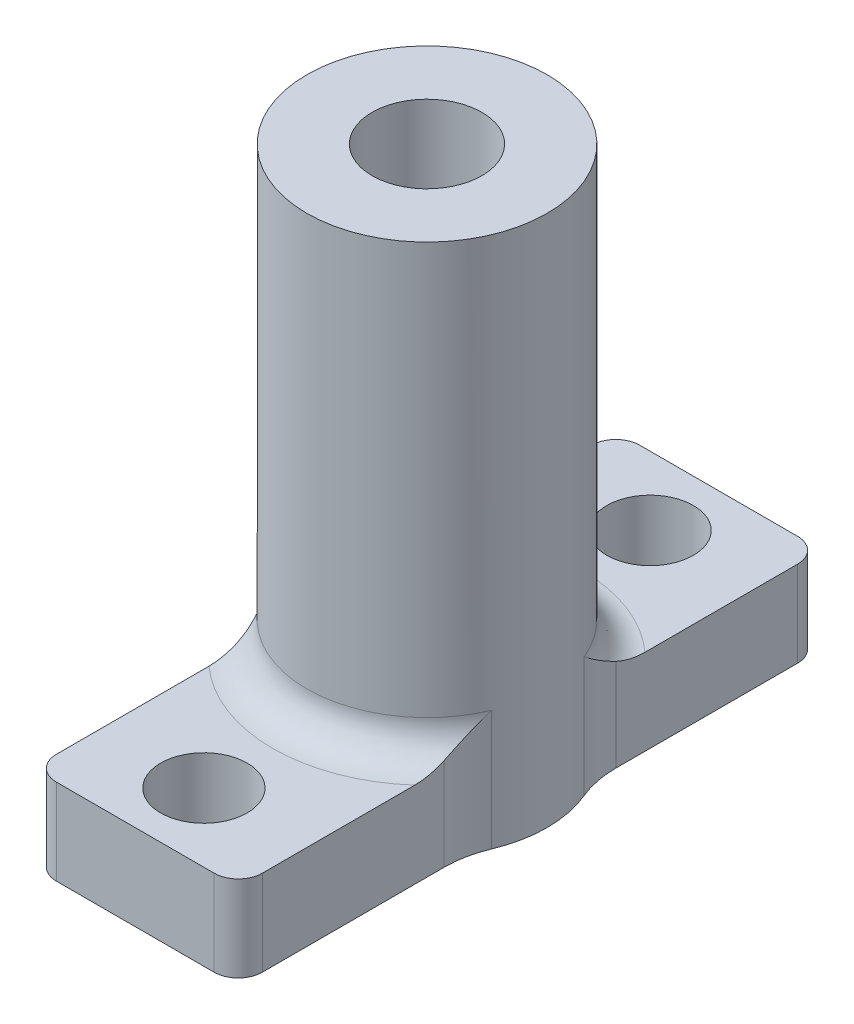
ISO-10303-21;
HEADER;
FILE_DESCRIPTION(('STEP AP214'),'2;1');
FILE_NAME('part.step','',(''),(''),'','','');
FILE_SCHEMA(('AUTOMOTIVE_DESIGN { 1 0 10303 214 1 1 1 1 }'));
ENDSEC;
DATA;
#1=APPLICATION_CONTEXT('core data for automotive mechanical design processes');
#2=APPLICATION_PROTOCOL_DEFINITION('international standard','automotive_design',2000,#1);
#3=PRODUCT_CONTEXT('',#1,'mechanical');
#4=PRODUCT('Part','Part','',(#3));
#5=PRODUCT_RELATED_PRODUCT_CATEGORY('part','',(#4));
#6=PRODUCT_DEFINITION_FORMATION('','',#4);
#7=PRODUCT_DEFINITION_CONTEXT('part definition',#1,'design');
#8=PRODUCT_DEFINITION('design','',#6,#7);
#9=PRODUCT_DEFINITION_SHAPE('','',#8);
#10=(LENGTH_UNIT() NAMED_UNIT(*) SI_UNIT(.MILLI.,.METRE.));
#11=(NAMED_UNIT(*) PLANE_ANGLE_UNIT() SI_UNIT($,.RADIAN.));
#12=(NAMED_UNIT(*) SI_UNIT($,.STERADIAN.) SOLID_ANGLE_UNIT());
#13=UNCERTAINTY_MEASURE_WITH_UNIT(LENGTH_MEASURE(1.E-05),#10,'distance_accuracy_value','');
#14=(GEOMETRIC_REPRESENTATION_CONTEXT(3) GLOBAL_UNCERTAINTY_ASSIGNED_CONTEXT((#13)) GLOBAL_UNIT_ASSIGNED_CONTEXT((#10,
#11,#12)) REPRESENTATION_CONTEXT('',''));
#15=CARTESIAN_POINT('',(0.,0.,0.));
#16=DIRECTION('',(0.,0.,1.));
#17=DIRECTION('',(1.,0.,0.));
#18=AXIS2_PLACEMENT_3D('',#15,#16,#17);
#19=CARTESIAN_POINT('',(0.,16.51,0.));
#20=DIRECTION('',(0.,1.,0.));
#21=DIRECTION('',(0.,0.,1.));
#22=AXIS2_PLACEMENT_3D('',#19,#20,#21);
#23=PLANE('',#22);
#24=CARTESIAN_POINT('',(0.,16.51,0.));
#25=DIRECTION('',(0.,1.,0.));
#26=DIRECTION('',(0.,0.,1.));
#27=AXIS2_PLACEMENT_3D('',#24,#25,#26);
#28=CIRCLE('',#27,4.445);
#29=CARTESIAN_POINT('',(0.,16.51,4.445));
#30=VERTEX_POINT('',#29);
#31=EDGE_CURVE('E356',#30,#30,#28,.T.);
#32=ORIENTED_EDGE('',*,*,#31,.T.);
#33=EDGE_LOOP('',(#32));
#34=FACE_BOUND('',#33,.T.);
#35=CARTESIAN_POINT('',(0.,16.51,0.));
#36=DIRECTION('',(0.,1.,0.));
#37=DIRECTION('',(0.,0.,1.));
#38=AXIS2_PLACEMENT_3D('',#35,#36,#37);
#39=CIRCLE('',#38,2.032);
#40=CARTESIAN_POINT('',(0.,16.51,2.032));
#41=VERTEX_POINT('',#40);
#42=EDGE_CURVE('E359',#41,#41,#39,.T.);
#43=ORIENTED_EDGE('',*,*,#42,.F.);
#44=EDGE_LOOP('',(#43));
#45=FACE_BOUND('',#44,.T.);
#46=ADVANCED_FACE('F45',(#34,#45),#23,.T.);
#47=CARTESIAN_POINT('',(0.,16.51,0.));
#48=DIRECTION('',(0.,-1.,0.));
#49=DIRECTION('',(0.,0.,-1.));
#50=AXIS2_PLACEMENT_3D('',#47,#48,#49);
#51=CYLINDRICAL_SURFACE('',#50,4.445);
#52=ORIENTED_EDGE('',*,*,#31,.F.);
#53=EDGE_LOOP('',(#52));
#54=FACE_BOUND('',#53,.T.);
#55=CARTESIAN_POINT('',(0.,1.27,0.));
#56=DIRECTION('',(0.,-1.,0.));
#57=DIRECTION('',(0.,0.,-1.));
#58=AXIS2_PLACEMENT_3D('',#55,#56,#57);
#59=CIRCLE('',#58,4.445);
#60=CARTESIAN_POINT('',(-4.10307692307692,1.27,1.70961538461538));
#61=VERTEX_POINT('',#60);
#62=CARTESIAN_POINT('',(4.10307692307692,1.27,1.70961538461538));
#63=VERTEX_POINT('',#62);
#64=EDGE_CURVE('E232',#61,#63,#59,.F.);
#65=ORIENTED_EDGE('',*,*,#64,.T.);
#66=DIRECTION('',(0.,-1.,0.));
#67=VECTOR('',#66,1.);
#68=CARTESIAN_POINT('',(4.10307692307692,16.51,1.70961538461538));
#69=LINE('',#68,#67);
#70=CARTESIAN_POINT('',(4.10307692307692,-3.175,1.70961538461538));
#71=VERTEX_POINT('',#70);
#72=EDGE_CURVE('E194',#63,#71,#69,.T.);
#73=ORIENTED_EDGE('',*,*,#72,.T.);
#74=CARTESIAN_POINT('',(0.,-3.175,0.));
#75=DIRECTION('',(0.,-1.,0.));
#76=DIRECTION('',(0.,0.,-1.));
#77=AXIS2_PLACEMENT_3D('',#74,#75,#76);
#78=CIRCLE('',#77,4.445);
#79=CARTESIAN_POINT('',(4.10307692307692,-3.175,-1.70961538461538));
#80=VERTEX_POINT('',#79);
#81=EDGE_CURVE('E177',#80,#71,#78,.T.);
#82=ORIENTED_EDGE('',*,*,#81,.F.);
#83=DIRECTION('',(0.,-1.,0.));
#84=VECTOR('',#83,1.);
#85=CARTESIAN_POINT('',(4.10307692307692,16.51,-1.70961538461538));
#86=LINE('',#85,#84);
#87=CARTESIAN_POINT('',(4.10307692307692,1.27,-1.70961538461538));
#88=VERTEX_POINT('',#87);
#89=EDGE_CURVE('E192',#80,#88,#86,.F.);
#90=ORIENTED_EDGE('',*,*,#89,.T.);
#91=CARTESIAN_POINT('',(0.,1.27,0.));
#92=DIRECTION('',(0.,-1.,0.));
#93=DIRECTION('',(0.,0.,-1.));
#94=AXIS2_PLACEMENT_3D('',#91,#92,#93);
#95=CIRCLE('',#94,4.445);
#96=CARTESIAN_POINT('',(-4.10307692307692,1.27,-1.70961538461538));
#97=VERTEX_POINT('',#96);
#98=EDGE_CURVE('E229',#88,#97,#95,.F.);
#99=ORIENTED_EDGE('',*,*,#98,.T.);
#100=DIRECTION('',(0.,-1.,0.));
#101=VECTOR('',#100,1.);
#102=CARTESIAN_POINT('',(-4.10307692307692,16.51,-1.70961538461538));
#103=LINE('',#102,#101);
#104=CARTESIAN_POINT('',(-4.10307692307692,-3.175,-1.70961538461538));
#105=VERTEX_POINT('',#104);
#106=EDGE_CURVE('E209',#97,#105,#103,.T.);
#107=ORIENTED_EDGE('',*,*,#106,.T.);
#108=CARTESIAN_POINT('',(0.,-3.175,0.));
#109=DIRECTION('',(0.,-1.,0.));
#110=DIRECTION('',(0.,0.,-1.));
#111=AXIS2_PLACEMENT_3D('',#108,#109,#110);
#112=CIRCLE('',#111,4.445);
#113=CARTESIAN_POINT('',(-4.10307692307692,-3.175,1.70961538461538));
#114=VERTEX_POINT('',#113);
#115=EDGE_CURVE('E371',#114,#105,#112,.T.);
#116=ORIENTED_EDGE('',*,*,#115,.F.);
#117=DIRECTION('',(0.,-1.,0.));
#118=VECTOR('',#117,1.);
#119=CARTESIAN_POINT('',(-4.10307692307692,16.51,1.70961538461538));
#120=LINE('',#119,#118);
#121=EDGE_CURVE('E358',#114,#61,#120,.F.);
#122=ORIENTED_EDGE('',*,*,#121,.T.);
#123=EDGE_LOOP('',(#65,#73,#82,#90,#99,#107,#116,#122));
#124=FACE_BOUND('',#123,.T.);
#125=ADVANCED_FACE('F190',(#54,#124),#51,.T.);
#126=CARTESIAN_POINT('',(0.,16.51,0.));
#127=DIRECTION('',(0.,-1.,0.));
#128=DIRECTION('',(0.,0.,-1.));
#129=AXIS2_PLACEMENT_3D('',#126,#127,#128);
#130=CYLINDRICAL_SURFACE('',#129,2.032);
#131=ORIENTED_EDGE('',*,*,#42,.T.);
#132=EDGE_LOOP('',(#131));
#133=FACE_BOUND('',#132,.T.);
#134=CARTESIAN_POINT('',(0.,0.,0.));
#135=DIRECTION('',(0.,1.,0.));
#136=DIRECTION('',(0.,0.,1.));
#137=AXIS2_PLACEMENT_3D('',#134,#135,#136);
#138=CIRCLE('',#137,2.032);
#139=CARTESIAN_POINT('',(0.,0.,2.032));
#140=VERTEX_POINT('',#139);
#141=EDGE_CURVE('E365',#140,#140,#138,.T.);
#142=ORIENTED_EDGE('',*,*,#141,.F.);
#143=EDGE_LOOP('',(#142));
#144=FACE_BOUND('',#143,.T.);
#145=ADVANCED_FACE('F341',(#133,#144),#130,.F.);
#146=CARTESIAN_POINT('',(0.,0.,0.));
#147=DIRECTION('',(0.,-1.,0.));
#148=DIRECTION('',(0.,0.,-1.));
#149=AXIS2_PLACEMENT_3D('',#146,#147,#148);
#150=PLANE('',#149);
#151=ORIENTED_EDGE('',*,*,#141,.T.);
#152=EDGE_LOOP('',(#151));
#153=FACE_BOUND('',#152,.T.);
#154=ADVANCED_FACE('F344',(#153),#150,.F.);
#155=DIRECTION('',(0.,0.,1.));
#156=VECTOR('',#155,1.);
#157=CARTESIAN_POINT('',(3.81,0.,-2.28952505991963));
#158=LINE('',#157,#156);
#159=CARTESIAN_POINT('',(3.81,0.,-9.906));
#160=VERTEX_POINT('',#159);
#161=CARTESIAN_POINT('',(3.81,0.,-4.2597094971371));
#162=VERTEX_POINT('',#161);
#163=EDGE_CURVE('E413',#160,#162,#158,.T.);
#164=ORIENTED_EDGE('',*,*,#163,.F.);
#165=CARTESIAN_POINT('',(2.921,0.,-9.906));
#166=DIRECTION('',(0.,-1.,0.));
#167=DIRECTION('',(0.,0.,-1.));
#168=AXIS2_PLACEMENT_3D('',#165,#166,#167);
#169=CIRCLE('',#168,0.889);
#170=CARTESIAN_POINT('',(2.921,0.,-10.795));
#171=VERTEX_POINT('',#170);
#172=EDGE_CURVE('E61',#160,#171,#169,.F.);
#173=ORIENTED_EDGE('',*,*,#172,.T.);
#174=DIRECTION('',(1.,0.,0.));
#175=VECTOR('',#174,1.);
#176=CARTESIAN_POINT('',(-3.81,0.,-10.795));
#177=LINE('',#176,#175);
#178=CARTESIAN_POINT('',(-2.921,0.,-10.795));
#179=VERTEX_POINT('',#178);
#180=EDGE_CURVE('E409',#179,#171,#177,.T.);
#181=ORIENTED_EDGE('',*,*,#180,.F.);
#182=CARTESIAN_POINT('',(-2.921,0.,-9.906));
#183=DIRECTION('',(0.,-1.,0.));
#184=DIRECTION('',(0.,0.,-1.));
#185=AXIS2_PLACEMENT_3D('',#182,#183,#184);
#186=CIRCLE('',#185,0.889);
#187=CARTESIAN_POINT('',(-3.81,0.,-9.906));
#188=VERTEX_POINT('',#187);
#189=EDGE_CURVE('E69',#179,#188,#186,.F.);
#190=ORIENTED_EDGE('',*,*,#189,.T.);
#191=DIRECTION('',(0.,0.,-1.));
#192=VECTOR('',#191,1.);
#193=CARTESIAN_POINT('',(-3.81,0.,-2.28952505991963));
#194=LINE('',#193,#192);
#195=CARTESIAN_POINT('',(-3.81,0.,-4.2597094971371));
#196=VERTEX_POINT('',#195);
#197=EDGE_CURVE('E406',#196,#188,#194,.T.);
#198=ORIENTED_EDGE('',*,*,#197,.F.);
#199=CARTESIAN_POINT('',(0.,0.,0.));
#200=DIRECTION('',(0.,-1.,0.));
#201=DIRECTION('',(0.,0.,-1.));
#202=AXIS2_PLACEMENT_3D('',#199,#200,#201);
#203=CIRCLE('',#202,5.715);
#204=EDGE_CURVE('E239',#196,#162,#203,.T.);
#205=ORIENTED_EDGE('',*,*,#204,.T.);
#206=EDGE_LOOP('',(#164,#173,#181,#190,#198,#205));
#207=FACE_BOUND('',#206,.T.);
#208=CARTESIAN_POINT('',(0.,0.,-8.255));
#209=DIRECTION('',(0.,-1.,0.));
#210=DIRECTION('',(0.,0.,1.));
#211=AXIS2_PLACEMENT_3D('',#208,#209,#210);
#212=CIRCLE('',#211,1.6002);
#213=CARTESIAN_POINT('',(0.,0.,-6.6548));
#214=VERTEX_POINT('',#213);
#215=EDGE_CURVE('E672',#214,#214,#212,.T.);
#216=ORIENTED_EDGE('',*,*,#215,.T.);
#217=EDGE_LOOP('',(#216));
#218=FACE_BOUND('',#217,.T.);
#219=ADVANCED_FACE('F512',(#207,#218),#150,.F.);
#220=CARTESIAN_POINT('',(0.,-3.175,0.));
#221=DIRECTION('',(0.,-1.,0.));
#222=DIRECTION('',(0.,0.,-1.));
#223=AXIS2_PLACEMENT_3D('',#220,#221,#222);
#224=PLANE('',#223);
#225=CARTESIAN_POINT('',(0.,-3.175,8.255));
#226=DIRECTION('',(0.,-1.,0.));
#227=DIRECTION('',(0.,0.,-1.));
#228=AXIS2_PLACEMENT_3D('',#225,#226,#227);
#229=CIRCLE('',#228,1.6002);
#230=CARTESIAN_POINT('',(0.,-3.175,6.6548));
#231=VERTEX_POINT('',#230);
#232=EDGE_CURVE('E410',#231,#231,#229,.T.);
#233=ORIENTED_EDGE('',*,*,#232,.F.);
#234=EDGE_LOOP('',(#233));
#235=FACE_BOUND('',#234,.T.);
#236=DIRECTION('',(-1.,0.,0.));
#237=VECTOR('',#236,1.);
#238=CARTESIAN_POINT('',(-3.81,-3.175,10.795));
#239=LINE('',#238,#237);
#240=CARTESIAN_POINT('',(2.921,-3.175,10.795));
#241=VERTEX_POINT('',#240);
#242=CARTESIAN_POINT('',(-2.921,-3.175,10.795));
#243=VERTEX_POINT('',#242);
#244=EDGE_CURVE('E400',#241,#243,#239,.T.);
#245=ORIENTED_EDGE('',*,*,#244,.T.);
#246=CARTESIAN_POINT('',(-2.921,-3.175,9.906));
#247=DIRECTION('',(0.,-1.,0.));
#248=DIRECTION('',(0.,0.,-1.));
#249=AXIS2_PLACEMENT_3D('',#246,#247,#248);
#250=CIRCLE('',#249,0.889);
#251=CARTESIAN_POINT('',(-3.81,-3.175,9.906));
#252=VERTEX_POINT('',#251);
#253=EDGE_CURVE('E474',#243,#252,#250,.T.);
#254=ORIENTED_EDGE('',*,*,#253,.T.);
#255=DIRECTION('',(0.,0.,-1.));
#256=VECTOR('',#255,1.);
#257=CARTESIAN_POINT('',(-3.81,-3.175,2.28952505991963));
#258=LINE('',#257,#256);
#259=CARTESIAN_POINT('',(-3.81,-3.175,3.175));
#260=VERTEX_POINT('',#259);
#261=EDGE_CURVE('E403',#252,#260,#258,.T.);
#262=ORIENTED_EDGE('',*,*,#261,.T.);
#263=CARTESIAN_POINT('',(-7.62,-3.175,3.175));
#264=DIRECTION('',(0.,-1.,0.));
#265=DIRECTION('',(0.,0.,-1.));
#266=AXIS2_PLACEMENT_3D('',#263,#264,#265);
#267=CIRCLE('',#266,3.81);
#268=EDGE_CURVE('E226',#260,#114,#267,.F.);
#269=ORIENTED_EDGE('',*,*,#268,.T.);
#270=ORIENTED_EDGE('',*,*,#115,.T.);
#271=CARTESIAN_POINT('',(-7.62,-3.175,-3.175));
#272=DIRECTION('',(0.,-1.,0.));
#273=DIRECTION('',(0.,0.,-1.));
#274=AXIS2_PLACEMENT_3D('',#271,#272,#273);
#275=CIRCLE('',#274,3.81);
#276=CARTESIAN_POINT('',(-3.81,-3.175,-3.175));
#277=VERTEX_POINT('',#276);
#278=EDGE_CURVE('E223',#105,#277,#275,.F.);
#279=ORIENTED_EDGE('',*,*,#278,.T.);
#280=DIRECTION('',(0.,0.,-1.));
#281=VECTOR('',#280,1.);
#282=CARTESIAN_POINT('',(-3.81,-3.175,-2.28952505991963));
#283=LINE('',#282,#281);
#284=CARTESIAN_POINT('',(-3.81,-3.175,-9.906));
#285=VERTEX_POINT('',#284);
#286=EDGE_CURVE('E379',#277,#285,#283,.T.);
#287=ORIENTED_EDGE('',*,*,#286,.T.);
#288=CARTESIAN_POINT('',(-2.921,-3.175,-9.906));
#289=DIRECTION('',(0.,-1.,0.));
#290=DIRECTION('',(0.,0.,-1.));
#291=AXIS2_PLACEMENT_3D('',#288,#289,#290);
#292=CIRCLE('',#291,0.889);
#293=CARTESIAN_POINT('',(-2.921,-3.175,-10.795));
#294=VERTEX_POINT('',#293);
#295=EDGE_CURVE('E476',#285,#294,#292,.T.);
#296=ORIENTED_EDGE('',*,*,#295,.T.);
#297=DIRECTION('',(1.,0.,0.));
#298=VECTOR('',#297,1.);
#299=CARTESIAN_POINT('',(-3.81,-3.175,-10.795));
#300=LINE('',#299,#298);
#301=CARTESIAN_POINT('',(2.921,-3.175,-10.795));
#302=VERTEX_POINT('',#301);
#303=EDGE_CURVE('E388',#294,#302,#300,.T.);
#304=ORIENTED_EDGE('',*,*,#303,.T.);
#305=CARTESIAN_POINT('',(2.921,-3.175,-9.906));
#306=DIRECTION('',(0.,-1.,0.));
#307=DIRECTION('',(0.,0.,-1.));
#308=AXIS2_PLACEMENT_3D('',#305,#306,#307);
#309=CIRCLE('',#308,0.889);
#310=CARTESIAN_POINT('',(3.81,-3.175,-9.906));
#311=VERTEX_POINT('',#310);
#312=EDGE_CURVE('E480',#302,#311,#309,.T.);
#313=ORIENTED_EDGE('',*,*,#312,.T.);
#314=DIRECTION('',(0.,0.,1.));
#315=VECTOR('',#314,1.);
#316=CARTESIAN_POINT('',(3.81,-3.175,-2.28952505991963));
#317=LINE('',#316,#315);
#318=CARTESIAN_POINT('',(3.81,-3.175,-3.175));
#319=VERTEX_POINT('',#318);
#320=EDGE_CURVE('E180',#311,#319,#317,.T.);
#321=ORIENTED_EDGE('',*,*,#320,.T.);
#322=CARTESIAN_POINT('',(7.62,-3.175,-3.175));
#323=DIRECTION('',(0.,-1.,0.));
#324=DIRECTION('',(0.,0.,-1.));
#325=AXIS2_PLACEMENT_3D('',#322,#323,#324);
#326=CIRCLE('',#325,3.81);
#327=EDGE_CURVE('E172',#319,#80,#326,.F.);
#328=ORIENTED_EDGE('',*,*,#327,.T.);
#329=ORIENTED_EDGE('',*,*,#81,.T.);
#330=CARTESIAN_POINT('',(7.62,-3.175,3.175));
#331=DIRECTION('',(0.,-1.,0.));
#332=DIRECTION('',(0.,0.,-1.));
#333=AXIS2_PLACEMENT_3D('',#330,#331,#332);
#334=CIRCLE('',#333,3.81);
#335=CARTESIAN_POINT('',(3.81,-3.175,3.175));
#336=VERTEX_POINT('',#335);
#337=EDGE_CURVE('E185',#71,#336,#334,.F.);
#338=ORIENTED_EDGE('',*,*,#337,.T.);
#339=DIRECTION('',(0.,0.,1.));
#340=VECTOR('',#339,1.);
#341=CARTESIAN_POINT('',(3.81,-3.175,2.28952505991963));
#342=LINE('',#341,#340);
#343=CARTESIAN_POINT('',(3.81,-3.175,9.906));
#344=VERTEX_POINT('',#343);
#345=EDGE_CURVE('E196',#336,#344,#342,.T.);
#346=ORIENTED_EDGE('',*,*,#345,.T.);
#347=CARTESIAN_POINT('',(2.921,-3.175,9.906));
#348=DIRECTION('',(0.,-1.,0.));
#349=DIRECTION('',(0.,0.,-1.));
#350=AXIS2_PLACEMENT_3D('',#347,#348,#349);
#351=CIRCLE('',#350,0.889);
#352=EDGE_CURVE('E487',#344,#241,#351,.T.);
#353=ORIENTED_EDGE('',*,*,#352,.T.);
#354=EDGE_LOOP('',(#245,#254,#262,#269,#270,#279,#287,#296,#304,#313,#321,#328,#329,#338,#346,#353));
#355=FACE_BOUND('',#354,.T.);
#356=CARTESIAN_POINT('',(0.,-3.175,-8.255));
#357=DIRECTION('',(0.,-1.,0.));
#358=DIRECTION('',(0.,0.,1.));
#359=AXIS2_PLACEMENT_3D('',#356,#357,#358);
#360=CIRCLE('',#359,1.6002);
#361=CARTESIAN_POINT('',(0.,-3.175,-6.6548));
#362=VERTEX_POINT('',#361);
#363=EDGE_CURVE('E669',#362,#362,#360,.T.);
#364=ORIENTED_EDGE('',*,*,#363,.F.);
#365=EDGE_LOOP('',(#364));
#366=FACE_BOUND('',#365,.T.);
#367=ADVANCED_FACE('F175',(#235,#355,#366),#224,.T.);
#368=DIRECTION('',(0.,0.,-1.));
#369=VECTOR('',#368,1.);
#370=CARTESIAN_POINT('',(-3.81,0.,2.28952505991963));
#371=LINE('',#370,#369);
#372=CARTESIAN_POINT('',(-3.81,0.,9.906));
#373=VERTEX_POINT('',#372);
#374=CARTESIAN_POINT('',(-3.81,0.,4.2597094971371));
#375=VERTEX_POINT('',#374);
#376=EDGE_CURVE('E380',#373,#375,#371,.T.);
#377=ORIENTED_EDGE('',*,*,#376,.F.);
#378=CARTESIAN_POINT('',(-2.921,0.,9.906));
#379=DIRECTION('',(0.,-1.,0.));
#380=DIRECTION('',(0.,0.,-1.));
#381=AXIS2_PLACEMENT_3D('',#378,#379,#380);
#382=CIRCLE('',#381,0.889);
#383=CARTESIAN_POINT('',(-2.921,0.,10.795));
#384=VERTEX_POINT('',#383);
#385=EDGE_CURVE('E473',#373,#384,#382,.F.);
#386=ORIENTED_EDGE('',*,*,#385,.T.);
#387=DIRECTION('',(-1.,0.,0.));
#388=VECTOR('',#387,1.);
#389=CARTESIAN_POINT('',(-3.81,0.,10.795));
#390=LINE('',#389,#388);
#391=CARTESIAN_POINT('',(2.921,0.,10.795));
#392=VERTEX_POINT('',#391);
#393=EDGE_CURVE('E420',#392,#384,#390,.T.);
#394=ORIENTED_EDGE('',*,*,#393,.F.);
#395=CARTESIAN_POINT('',(2.921,0.,9.906));
#396=DIRECTION('',(0.,-1.,0.));
#397=DIRECTION('',(0.,0.,-1.));
#398=AXIS2_PLACEMENT_3D('',#395,#396,#397);
#399=CIRCLE('',#398,0.889);
#400=CARTESIAN_POINT('',(3.81,0.,9.906));
#401=VERTEX_POINT('',#400);
#402=EDGE_CURVE('E518',#392,#401,#399,.F.);
#403=ORIENTED_EDGE('',*,*,#402,.T.);
#404=DIRECTION('',(0.,0.,1.));
#405=VECTOR('',#404,1.);
#406=CARTESIAN_POINT('',(3.81,0.,2.28952505991963));
#407=LINE('',#406,#405);
#408=CARTESIAN_POINT('',(3.81,0.,4.2597094971371));
#409=VERTEX_POINT('',#408);
#410=EDGE_CURVE('E416',#409,#401,#407,.T.);
#411=ORIENTED_EDGE('',*,*,#410,.F.);
#412=CARTESIAN_POINT('',(0.,0.,0.));
#413=DIRECTION('',(0.,-1.,0.));
#414=DIRECTION('',(0.,0.,-1.));
#415=AXIS2_PLACEMENT_3D('',#412,#413,#414);
#416=CIRCLE('',#415,5.715);
#417=EDGE_CURVE('E235',#409,#375,#416,.T.);
#418=ORIENTED_EDGE('',*,*,#417,.T.);
#419=EDGE_LOOP('',(#377,#386,#394,#403,#411,#418));
#420=FACE_BOUND('',#419,.T.);
#421=CARTESIAN_POINT('',(0.,0.,8.255));
#422=DIRECTION('',(0.,-1.,0.));
#423=DIRECTION('',(0.,0.,-1.));
#424=AXIS2_PLACEMENT_3D('',#421,#422,#423);
#425=CIRCLE('',#424,1.6002);
#426=CARTESIAN_POINT('',(0.,0.,6.6548));
#427=VERTEX_POINT('',#426);
#428=EDGE_CURVE('E676',#427,#427,#425,.T.);
#429=ORIENTED_EDGE('',*,*,#428,.T.);
#430=EDGE_LOOP('',(#429));
#431=FACE_BOUND('',#430,.T.);
#432=ADVANCED_FACE('F339',(#420,#431),#150,.F.);
#433=CARTESIAN_POINT('',(-3.81,-3.175,-2.28952505991963));
#434=DIRECTION('',(1.,0.,0.));
#435=DIRECTION('',(0.,0.,-1.));
#436=AXIS2_PLACEMENT_3D('',#433,#434,#435);
#437=PLANE('',#436);
#438=ORIENTED_EDGE('',*,*,#197,.T.);
#439=DIRECTION('',(0.,1.,0.));
#440=VECTOR('',#439,1.);
#441=CARTESIAN_POINT('',(-3.81,-3.175,-9.906));
#442=LINE('',#441,#440);
#443=EDGE_CURVE('E11',#188,#285,#442,.F.);
#444=ORIENTED_EDGE('',*,*,#443,.T.);
#445=ORIENTED_EDGE('',*,*,#286,.F.);
#446=DIRECTION('',(0.,1.,0.));
#447=VECTOR('',#446,1.);
#448=CARTESIAN_POINT('',(-3.81,0.,-3.175));
#449=LINE('',#448,#447);
#450=CARTESIAN_POINT('',(-3.81,0.249151010083022,-3.175));
#451=VERTEX_POINT('',#450);
#452=EDGE_CURVE('E215',#277,#451,#449,.T.);
#453=ORIENTED_EDGE('',*,*,#452,.T.);
#454=CARTESIAN_POINT('',(-3.81,0.249151010083022,-3.175));
#455=CARTESIAN_POINT('',(-3.81,0.21742599614734,-3.24204110308694));
#456=CARTESIAN_POINT('',(-3.81,0.188575621440352,-3.31043744653979));
#457=CARTESIAN_POINT('',(-3.81,0.136730294097974,-3.44950302953295));
#458=CARTESIAN_POINT('',(-3.81,0.113741966726007,-3.52017474001827));
#459=CARTESIAN_POINT('',(-3.81,0.0741798383839251,-3.66183620580076));
#460=CARTESIAN_POINT('',(-3.81,0.0574920474111934,-3.73279418153959));
#461=CARTESIAN_POINT('',(-3.81,0.0302217326753694,-3.87582895083962));
#462=CARTESIAN_POINT('',(-3.81,0.0196340189360692,-3.94790473957727));
#463=CARTESIAN_POINT('',(-3.81,0.00824309388099059,-4.05996025969016));
#464=CARTESIAN_POINT('',(-3.81,0.00518038718263022,-4.09972008428969));
#465=CARTESIAN_POINT('',(-3.81,0.00105411869694772,-4.17955311988807));
#466=CARTESIAN_POINT('',(-3.81,1.18931897270051E-06,-4.21962687756949));
#467=CARTESIAN_POINT('',(-3.81,0.,-4.2597094971371));
#468=B_SPLINE_CURVE_WITH_KNOTS('',3,(#454,#455,#456,#457,#458,#459,#460,#461,#462,#463,#464,
#465,#466,#467),.UNSPECIFIED.,.F.,.F.,(4,2,2,2,2,2,4),(0.,0.222432379832525,0.445115048685438,
0.663550152447696,0.881799135041381,1.00138668798613,1.12160516524277),.UNSPECIFIED.);
#469=EDGE_CURVE('E288',#451,#196,#468,.T.);
#470=ORIENTED_EDGE('',*,*,#469,.T.);
#471=EDGE_LOOP('',(#438,#444,#445,#453,#470));
#472=FACE_BOUND('',#471,.T.);
#473=ADVANCED_FACE('F334',(#472),#437,.F.);
#474=CARTESIAN_POINT('',(-3.81,-3.175,-10.795));
#475=DIRECTION('',(0.,0.,1.));
#476=DIRECTION('',(1.,0.,0.));
#477=AXIS2_PLACEMENT_3D('',#474,#475,#476);
#478=PLANE('',#477);
#479=ORIENTED_EDGE('',*,*,#180,.T.);
#480=DIRECTION('',(0.,1.,0.));
#481=VECTOR('',#480,1.);
#482=CARTESIAN_POINT('',(2.921,-3.175,-10.795));
#483=LINE('',#482,#481);
#484=EDGE_CURVE('E54',#171,#302,#483,.F.);
#485=ORIENTED_EDGE('',*,*,#484,.T.);
#486=ORIENTED_EDGE('',*,*,#303,.F.);
#487=DIRECTION('',(0.,1.,0.));
#488=VECTOR('',#487,1.);
#489=CARTESIAN_POINT('',(-2.921,-3.175,-10.795));
#490=LINE('',#489,#488);
#491=EDGE_CURVE('E503',#294,#179,#490,.T.);
#492=ORIENTED_EDGE('',*,*,#491,.T.);
#493=EDGE_LOOP('',(#479,#485,#486,#492));
#494=FACE_BOUND('',#493,.T.);
#495=ADVANCED_FACE('F329',(#494),#478,.F.);
#496=CARTESIAN_POINT('',(3.81,-3.175,-2.28952505991963));
#497=DIRECTION('',(-1.,0.,0.));
#498=DIRECTION('',(0.,0.,1.));
#499=AXIS2_PLACEMENT_3D('',#496,#497,#498);
#500=PLANE('',#499);
#501=ORIENTED_EDGE('',*,*,#320,.F.);
#502=DIRECTION('',(0.,1.,0.));
#503=VECTOR('',#502,1.);
#504=CARTESIAN_POINT('',(3.81,-3.175,-9.906));
#505=LINE('',#504,#503);
#506=EDGE_CURVE('E495',#311,#160,#505,.T.);
#507=ORIENTED_EDGE('',*,*,#506,.T.);
#508=ORIENTED_EDGE('',*,*,#163,.T.);
#509=CARTESIAN_POINT('',(3.81,0.,-4.2597094971371));
#510=CARTESIAN_POINT('',(3.81,1.04531062955972E-05,-4.18944595477948));
#511=CARTESIAN_POINT('',(3.81,0.00323904782795905,-4.1192131855996));
#512=CARTESIAN_POINT('',(3.81,0.0157702429140261,-3.9793178250911));
#513=CARTESIAN_POINT('',(3.81,0.0250702013553647,-3.90965499909868));
#514=CARTESIAN_POINT('',(3.81,0.0491745184108164,-3.77252928716142));
#515=CARTESIAN_POINT('',(3.81,0.063881987676254,-3.70504915375426));
#516=CARTESIAN_POINT('',(3.81,0.0985664506616688,-3.57145155241416));
#517=CARTESIAN_POINT('',(3.81,0.118543601897183,-3.50533412527743));
#518=CARTESIAN_POINT('',(3.81,0.156656583121643,-3.3949650270555));
#519=CARTESIAN_POINT('',(3.81,0.173464815057253,-3.35025016832253));
#520=CARTESIAN_POINT('',(3.81,0.209498052020766,-3.26183616892618));
#521=CARTESIAN_POINT('',(3.81,0.228721628449118,-3.21813644579837));
#522=CARTESIAN_POINT('',(3.81,0.249151010083117,-3.17500000000003));
#523=B_SPLINE_CURVE_WITH_KNOTS('',3,(#509,#510,#511,#512,#513,#514,#515,#516,#517,#518,#519,
#520,#521,#522),.UNSPECIFIED.,.F.,.F.,(4,2,2,2,2,2,4),(0.,0.210673777651764,0.421255942729598,
0.628235535953296,0.835221316684533,0.97846314164661,1.12162063896808),.UNSPECIFIED.);
#524=CARTESIAN_POINT('',(3.81,0.249151010083022,-3.175));
#525=VERTEX_POINT('',#524);
#526=EDGE_CURVE('E311',#162,#525,#523,.T.);
#527=ORIENTED_EDGE('',*,*,#526,.T.);
#528=DIRECTION('',(0.,1.,0.));
#529=VECTOR('',#528,1.);
#530=CARTESIAN_POINT('',(3.81,-3.175,-3.175));
#531=LINE('',#530,#529);
#532=EDGE_CURVE('E203',#525,#319,#531,.F.);
#533=ORIENTED_EDGE('',*,*,#532,.T.);
#534=EDGE_LOOP('',(#501,#507,#508,#527,#533));
#535=FACE_BOUND('',#534,.T.);
#536=ADVANCED_FACE('F324',(#535),#500,.F.);
#537=CARTESIAN_POINT('',(3.81,-3.175,2.28952505991963));
#538=DIRECTION('',(-1.,0.,0.));
#539=DIRECTION('',(0.,0.,1.));
#540=AXIS2_PLACEMENT_3D('',#537,#538,#539);
#541=PLANE('',#540);
#542=ORIENTED_EDGE('',*,*,#410,.T.);
#543=DIRECTION('',(0.,1.,0.));
#544=VECTOR('',#543,1.);
#545=CARTESIAN_POINT('',(3.81,-3.175,9.906));
#546=LINE('',#545,#544);
#547=EDGE_CURVE('E492',#401,#344,#546,.F.);
#548=ORIENTED_EDGE('',*,*,#547,.T.);
#549=ORIENTED_EDGE('',*,*,#345,.F.);
#550=DIRECTION('',(0.,1.,0.));
#551=VECTOR('',#550,1.);
#552=CARTESIAN_POINT('',(3.81,0.,3.175));
#553=LINE('',#552,#551);
#554=CARTESIAN_POINT('',(3.81,0.249151010083022,3.175));
#555=VERTEX_POINT('',#554);
#556=EDGE_CURVE('E207',#336,#555,#553,.T.);
#557=ORIENTED_EDGE('',*,*,#556,.T.);
#558=CARTESIAN_POINT('',(3.81,0.249151010083022,3.175));
#559=CARTESIAN_POINT('',(3.81,0.217425996147341,3.24204110308694));
#560=CARTESIAN_POINT('',(3.81,0.188575621440352,3.31043744653979));
#561=CARTESIAN_POINT('',(3.81,0.136730294097974,3.44950302953295));
#562=CARTESIAN_POINT('',(3.81,0.113741966726008,3.52017474001827));
#563=CARTESIAN_POINT('',(3.81,0.0741798383839252,3.66183620580076));
#564=CARTESIAN_POINT('',(3.81,0.0574920474111937,3.73279418153959));
#565=CARTESIAN_POINT('',(3.81,0.0302217326753699,3.87582895083962));
#566=CARTESIAN_POINT('',(3.81,0.0196340189360697,3.94790473957727));
#567=CARTESIAN_POINT('',(3.81,0.00824309388099078,4.05996025969016));
#568=CARTESIAN_POINT('',(3.81,0.00518038718263023,4.09972008428969));
#569=CARTESIAN_POINT('',(3.81,0.00105411869694754,4.17955311988807));
#570=CARTESIAN_POINT('',(3.81,1.18931897249361E-06,4.2196268775695));
#571=CARTESIAN_POINT('',(3.81,0.,4.2597094971371));
#572=B_SPLINE_CURVE_WITH_KNOTS('',3,(#558,#559,#560,#561,#562,#563,#564,#565,#566,#567,#568,
#569,#570,#571),.UNSPECIFIED.,.F.,.F.,(4,2,2,2,2,2,4),(0.,0.222432379832525,0.445115048685438,
0.663550152447697,0.881799135041381,1.00138668798613,1.12160516524278),.UNSPECIFIED.);
#573=EDGE_CURVE('E253',#555,#409,#572,.T.);
#574=ORIENTED_EDGE('',*,*,#573,.T.);
#575=EDGE_LOOP('',(#542,#548,#549,#557,#574));
#576=FACE_BOUND('',#575,.T.);
#577=ADVANCED_FACE('F328',(#576),#541,.F.);
#578=CARTESIAN_POINT('',(-3.81,-3.175,10.795));
#579=DIRECTION('',(0.,0.,-1.));
#580=DIRECTION('',(-1.,0.,0.));
#581=AXIS2_PLACEMENT_3D('',#578,#579,#580);
#582=PLANE('',#581);
#583=ORIENTED_EDGE('',*,*,#393,.T.);
#584=DIRECTION('',(0.,1.,0.));
#585=VECTOR('',#584,1.);
#586=CARTESIAN_POINT('',(-2.921,-3.175,10.795));
#587=LINE('',#586,#585);
#588=EDGE_CURVE('E468',#384,#243,#587,.F.);
#589=ORIENTED_EDGE('',*,*,#588,.T.);
#590=ORIENTED_EDGE('',*,*,#244,.F.);
#591=DIRECTION('',(0.,1.,0.));
#592=VECTOR('',#591,1.);
#593=CARTESIAN_POINT('',(2.921,-3.175,10.795));
#594=LINE('',#593,#592);
#595=EDGE_CURVE('E470',#241,#392,#594,.T.);
#596=ORIENTED_EDGE('',*,*,#595,.T.);
#597=EDGE_LOOP('',(#583,#589,#590,#596));
#598=FACE_BOUND('',#597,.T.);
#599=ADVANCED_FACE('F456',(#598),#582,.F.);
#600=CARTESIAN_POINT('',(-3.81,-3.175,2.28952505991963));
#601=DIRECTION('',(1.,0.,0.));
#602=DIRECTION('',(0.,0.,-1.));
#603=AXIS2_PLACEMENT_3D('',#600,#601,#602);
#604=PLANE('',#603);
#605=ORIENTED_EDGE('',*,*,#261,.F.);
#606=DIRECTION('',(0.,1.,0.));
#607=VECTOR('',#606,1.);
#608=CARTESIAN_POINT('',(-3.81,-3.175,9.906));
#609=LINE('',#608,#607);
#610=EDGE_CURVE('E435',#252,#373,#609,.T.);
#611=ORIENTED_EDGE('',*,*,#610,.T.);
#612=ORIENTED_EDGE('',*,*,#376,.T.);
#613=CARTESIAN_POINT('',(-3.81,0.,4.2597094971371));
#614=CARTESIAN_POINT('',(-3.81,1.0453106295336E-05,4.18944595477948));
#615=CARTESIAN_POINT('',(-3.81,0.00323904782795886,4.1192131855996));
#616=CARTESIAN_POINT('',(-3.81,0.0157702429140262,3.9793178250911));
#617=CARTESIAN_POINT('',(-3.81,0.0250702013553649,3.90965499909868));
#618=CARTESIAN_POINT('',(-3.81,0.0491745184108165,3.77252928716142));
#619=CARTESIAN_POINT('',(-3.81,0.0638819876762539,3.70504915375426));
#620=CARTESIAN_POINT('',(-3.81,0.0985664506616688,3.57145155241416));
#621=CARTESIAN_POINT('',(-3.81,0.118543601897184,3.50533412527743));
#622=CARTESIAN_POINT('',(-3.81,0.156656583121644,3.3949650270555));
#623=CARTESIAN_POINT('',(-3.81,0.173464815057253,3.35025016832253));
#624=CARTESIAN_POINT('',(-3.81,0.209498052020765,3.26183616892618));
#625=CARTESIAN_POINT('',(-3.81,0.228721628449117,3.21813644579837));
#626=CARTESIAN_POINT('',(-3.81,0.249151010083116,3.17500000000003));
#627=B_SPLINE_CURVE_WITH_KNOTS('',3,(#613,#614,#615,#616,#617,#618,#619,#620,#621,#622,#623,
#624,#625,#626),.UNSPECIFIED.,.F.,.F.,(4,2,2,2,2,2,4),(0.,0.210673777651764,0.421255942729598,
0.628235535953296,0.835221316684534,0.978463141646609,1.12162063896808),.UNSPECIFIED.);
#628=CARTESIAN_POINT('',(-3.81,0.249151010083022,3.175));
#629=VERTEX_POINT('',#628);
#630=EDGE_CURVE('E432',#375,#629,#627,.T.);
#631=ORIENTED_EDGE('',*,*,#630,.T.);
#632=DIRECTION('',(0.,1.,0.));
#633=VECTOR('',#632,1.);
#634=CARTESIAN_POINT('',(-3.81,-3.175,3.175));
#635=LINE('',#634,#633);
#636=EDGE_CURVE('E186',#629,#260,#635,.F.);
#637=ORIENTED_EDGE('',*,*,#636,.T.);
#638=EDGE_LOOP('',(#605,#611,#612,#631,#637));
#639=FACE_BOUND('',#638,.T.);
#640=ADVANCED_FACE('F430',(#639),#604,.F.);
#641=CARTESIAN_POINT('',(0.,-3.175,8.255));
#642=DIRECTION('',(0.,1.,0.));
#643=DIRECTION('',(0.,0.,1.));
#644=AXIS2_PLACEMENT_3D('',#641,#642,#643);
#645=CYLINDRICAL_SURFACE('',#644,1.6002);
#646=ORIENTED_EDGE('',*,*,#232,.T.);
#647=EDGE_LOOP('',(#646));
#648=FACE_BOUND('',#647,.T.);
#649=ORIENTED_EDGE('',*,*,#428,.F.);
#650=EDGE_LOOP('',(#649));
#651=FACE_BOUND('',#650,.T.);
#652=ADVANCED_FACE('F455',(#648,#651),#645,.F.);
#653=CARTESIAN_POINT('',(0.,-3.175,-8.255));
#654=DIRECTION('',(0.,1.,0.));
#655=DIRECTION('',(0.,0.,1.));
#656=AXIS2_PLACEMENT_3D('',#653,#654,#655);
#657=CYLINDRICAL_SURFACE('',#656,1.6002);
#658=ORIENTED_EDGE('',*,*,#363,.T.);
#659=EDGE_LOOP('',(#658));
#660=FACE_BOUND('',#659,.T.);
#661=ORIENTED_EDGE('',*,*,#215,.F.);
#662=EDGE_LOOP('',(#661));
#663=FACE_BOUND('',#662,.T.);
#664=ADVANCED_FACE('F603',(#660,#663),#657,.F.);
#665=CARTESIAN_POINT('',(7.62,16.51,-3.175));
#666=DIRECTION('',(0.,-1.,0.));
#667=DIRECTION('',(0.,0.,-1.));
#668=AXIS2_PLACEMENT_3D('',#665,#666,#667);
#669=CYLINDRICAL_SURFACE('',#668,3.81);
#670=ORIENTED_EDGE('',*,*,#327,.F.);
#671=ORIENTED_EDGE('',*,*,#532,.F.);
#672=CARTESIAN_POINT('',(3.81,0.249151010083022,-3.175));
#673=CARTESIAN_POINT('',(3.81000110959259,0.269739300214294,-3.13155057188426));
#674=CARTESIAN_POINT('',(3.81074311096866,0.291204329863128,-3.08853276872753));
#675=CARTESIAN_POINT('',(3.81362934442541,0.335663294586329,-3.00336434275814));
#676=CARTESIAN_POINT('',(3.81577297342446,0.358656568278776,-2.96121335502067));
#677=CARTESIAN_POINT('',(3.82417667786395,0.429523825926755,-2.83618072940711));
#678=CARTESIAN_POINT('',(3.83241022979654,0.479370678462011,-2.75454297363824));
#679=CARTESIAN_POINT('',(3.85357475561617,0.582627476301711,-2.59482856949318));
#680=CARTESIAN_POINT('',(3.86648163464469,0.636018018148283,-2.51673592634145));
#681=CARTESIAN_POINT('',(3.89664491179876,0.745513313373163,-2.36331054865077));
#682=CARTESIAN_POINT('',(3.9139031022798,0.801619177509805,-2.2879789661062));
#683=CARTESIAN_POINT('',(3.95561366891568,0.924672120829234,-2.12797687237629));
#684=CARTESIAN_POINT('',(3.98077377080498,0.991923905754199,-2.04372725497976));
#685=CARTESIAN_POINT('',(4.03649393413668,1.12758297154211,-1.8779938891762));
#686=CARTESIAN_POINT('',(4.06705379008905,1.19599020834427,-1.79651003565741));
#687=CARTESIAN_POINT('',(4.1012535066345,1.26626569564344,-1.71399736448389));
#688=CARTESIAN_POINT('',(4.10216419719745,1.26813285328976,-1.71180594338378));
#689=CARTESIAN_POINT('',(4.10307692307692,1.27,-1.70961538461538));
#690=B_SPLINE_CURVE_WITH_KNOTS('',3,(#672,#673,#674,#675,#676,#677,#678,#679,#680,#681,#682,
#683,#684,#685,#686,#687,#688,#689),.UNSPECIFIED.,.F.,.F.,(4,2,2,2,2,2,2,2,4),(0.,
0.144202333842114,0.288342662199511,0.576037273221661,0.862269223646102,1.14861926949235,
1.48052493218385,1.81241796677811,1.82147675161694),.UNSPECIFIED.);
#691=EDGE_CURVE('E200',#525,#88,#690,.T.);
#692=ORIENTED_EDGE('',*,*,#691,.T.);
#693=ORIENTED_EDGE('',*,*,#89,.F.);
#694=EDGE_LOOP('',(#670,#671,#692,#693));
#695=FACE_BOUND('',#694,.T.);
#696=ADVANCED_FACE('F198',(#695),#669,.F.);
#697=CARTESIAN_POINT('',(7.62,16.51,3.175));
#698=DIRECTION('',(0.,-1.,0.));
#699=DIRECTION('',(0.,0.,-1.));
#700=AXIS2_PLACEMENT_3D('',#697,#698,#699);
#701=CYLINDRICAL_SURFACE('',#700,3.81);
#702=ORIENTED_EDGE('',*,*,#337,.F.);
#703=ORIENTED_EDGE('',*,*,#72,.F.);
#704=CARTESIAN_POINT('',(3.81,0.249151010083022,3.175));
#705=CARTESIAN_POINT('',(3.81000110959259,0.269739300214295,3.13155057188426));
#706=CARTESIAN_POINT('',(3.81074311096866,0.29120432986313,3.08853276872753));
#707=CARTESIAN_POINT('',(3.81362934442541,0.335663294586332,3.00336434275813));
#708=CARTESIAN_POINT('',(3.81577297342446,0.358656568278781,2.96121335502066));
#709=CARTESIAN_POINT('',(3.82417667786396,0.429523825926764,2.8361807294071));
#710=CARTESIAN_POINT('',(3.83241022979654,0.479370678462023,2.75454297363822));
#711=CARTESIAN_POINT('',(3.85357475561618,0.582627476301721,2.59482856949316));
#712=CARTESIAN_POINT('',(3.8664816346447,0.636018018148289,2.51673592634144));
#713=CARTESIAN_POINT('',(3.89664491179876,0.745513313373167,2.36331054865076));
#714=CARTESIAN_POINT('',(3.9139031022798,0.801619177509812,2.2879789661062));
#715=CARTESIAN_POINT('',(3.95561366891569,0.924672120829229,2.12797687237628));
#716=CARTESIAN_POINT('',(3.98077377080499,0.991923905754177,2.04372725497975));
#717=CARTESIAN_POINT('',(4.03649393413667,1.12758297154213,1.87799388917621));
#718=CARTESIAN_POINT('',(4.06705379008902,1.19599020834435,1.79651003565747));
#719=CARTESIAN_POINT('',(4.1012535066345,1.26626569564345,1.71399736448389));
#720=CARTESIAN_POINT('',(4.10216419719745,1.26813285328976,1.71180594338378));
#721=CARTESIAN_POINT('',(4.10307692307692,1.27,1.70961538461538));
#722=B_SPLINE_CURVE_WITH_KNOTS('',3,(#704,#705,#706,#707,#708,#709,#710,#711,#712,#713,#714,
#715,#716,#717,#718,#719,#720,#721),.UNSPECIFIED.,.F.,.F.,(4,2,2,2,2,2,2,2,4),(0.,
0.144202333842121,0.288342662199524,0.576037273221685,0.862269223646114,1.14861926949235,
1.48052493218384,1.81241796677811,1.82147675161694),.UNSPECIFIED.);
#723=EDGE_CURVE('E243',#63,#555,#722,.F.);
#724=ORIENTED_EDGE('',*,*,#723,.T.);
#725=ORIENTED_EDGE('',*,*,#556,.F.);
#726=EDGE_LOOP('',(#702,#703,#724,#725));
#727=FACE_BOUND('',#726,.T.);
#728=ADVANCED_FACE('F264',(#727),#701,.F.);
#729=CARTESIAN_POINT('',(-7.62,16.51,-3.175));
#730=DIRECTION('',(0.,-1.,0.));
#731=DIRECTION('',(0.,0.,-1.));
#732=AXIS2_PLACEMENT_3D('',#729,#730,#731);
#733=CYLINDRICAL_SURFACE('',#732,3.81);
#734=ORIENTED_EDGE('',*,*,#278,.F.);
#735=ORIENTED_EDGE('',*,*,#106,.F.);
#736=CARTESIAN_POINT('',(-3.81,0.249151010083022,-3.175));
#737=CARTESIAN_POINT('',(-3.81000110959259,0.26973930021429,-3.13155057188427));
#738=CARTESIAN_POINT('',(-3.81074311096866,0.291204329863121,-3.08853276872755));
#739=CARTESIAN_POINT('',(-3.81362934442541,0.335663294586314,-3.00336434275817));
#740=CARTESIAN_POINT('',(-3.81577297342446,0.358656568278757,-2.9612133550207));
#741=CARTESIAN_POINT('',(-3.82417667786395,0.429523825926726,-2.83618072940716));
#742=CARTESIAN_POINT('',(-3.83241022979653,0.479370678461974,-2.75454297363829));
#743=CARTESIAN_POINT('',(-3.85357475561616,0.582627476301675,-2.59482856949323));
#744=CARTESIAN_POINT('',(-3.86648163464469,0.636018018148257,-2.5167359263415));
#745=CARTESIAN_POINT('',(-3.89664491179876,0.745513313373144,-2.36331054865078));
#746=CARTESIAN_POINT('',(-3.9139031022798,0.801619177509783,-2.28797896610619));
#747=CARTESIAN_POINT('',(-3.95561366891568,0.924672120829253,-2.1279768723763));
#748=CARTESIAN_POINT('',(-3.98077377080496,0.991923905754271,-2.04372725497981));
#749=CARTESIAN_POINT('',(-4.0364939341367,1.12758297154204,-1.87799388917614));
#750=CARTESIAN_POINT('',(-4.06705379008913,1.195990208344,-1.79651003565722));
#751=CARTESIAN_POINT('',(-4.1012535066345,1.26626569564343,-1.71399736448388));
#752=CARTESIAN_POINT('',(-4.10216419719745,1.26813285328975,-1.71180594338377));
#753=CARTESIAN_POINT('',(-4.10307692307692,1.27,-1.70961538461538));
#754=B_SPLINE_CURVE_WITH_KNOTS('',3,(#736,#737,#738,#739,#740,#741,#742,#743,#744,#745,#746,
#747,#748,#749,#750,#751,#752,#753),.UNSPECIFIED.,.F.,.F.,(4,2,2,2,2,2,2,2,4),(0.,
0.144202333842093,0.288342662199467,0.576037273221583,0.862269223646066,1.14861926949236,
1.48052493218385,1.81241796677811,1.82147675161694),.UNSPECIFIED.);
#755=EDGE_CURVE('E279',#97,#451,#754,.F.);
#756=ORIENTED_EDGE('',*,*,#755,.T.);
#757=ORIENTED_EDGE('',*,*,#452,.F.);
#758=EDGE_LOOP('',(#734,#735,#756,#757));
#759=FACE_BOUND('',#758,.T.);
#760=ADVANCED_FACE('F269',(#759),#733,.F.);
#761=CARTESIAN_POINT('',(-7.62,16.51,3.175));
#762=DIRECTION('',(0.,-1.,0.));
#763=DIRECTION('',(0.,0.,-1.));
#764=AXIS2_PLACEMENT_3D('',#761,#762,#763);
#765=CYLINDRICAL_SURFACE('',#764,3.81);
#766=ORIENTED_EDGE('',*,*,#268,.F.);
#767=ORIENTED_EDGE('',*,*,#636,.F.);
#768=CARTESIAN_POINT('',(-3.81,0.249151010083022,3.175));
#769=CARTESIAN_POINT('',(-3.81000110959259,0.269739300214317,3.13155057188422));
#770=CARTESIAN_POINT('',(-3.81074311096866,0.291204329863176,3.08853276872744));
#771=CARTESIAN_POINT('',(-3.81362934442541,0.335663294586427,3.00336434275795));
#772=CARTESIAN_POINT('',(-3.81577297342447,0.358656568278901,2.96121335502044));
#773=CARTESIAN_POINT('',(-3.82417667786398,0.42952382592696,2.83618072940677));
#774=CARTESIAN_POINT('',(-3.83241022979658,0.479370678462275,2.75454297363783));
#775=CARTESIAN_POINT('',(-3.85357475561624,0.582627476301966,2.59482856949278));
#776=CARTESIAN_POINT('',(-3.86648163464476,0.636018018148465,2.51673592634113));
#777=CARTESIAN_POINT('',(-3.89664491179878,0.745513313373301,2.36331054865064));
#778=CARTESIAN_POINT('',(-3.91390310227979,0.801619177509973,2.28797896610621));
#779=CARTESIAN_POINT('',(-3.95561366891572,0.924672120829104,2.1279768723762));
#780=CARTESIAN_POINT('',(-3.98077377080514,0.991923905753674,2.04372725497939));
#781=CARTESIAN_POINT('',(-4.03649393413652,1.12758297154263,1.87799388917658));
#782=CARTESIAN_POINT('',(-4.06705379008846,1.19599020834621,1.79651003565883));
#783=CARTESIAN_POINT('',(-4.10125350663446,1.26626569564355,1.71399736448396));
#784=CARTESIAN_POINT('',(-4.10216419719743,1.26813285328981,1.71180594338381));
#785=CARTESIAN_POINT('',(-4.10307692307692,1.27,1.70961538461538));
#786=B_SPLINE_CURVE_WITH_KNOTS('',3,(#768,#769,#770,#771,#772,#773,#774,#775,#776,#777,#778,
#779,#780,#781,#782,#783,#784,#785),.UNSPECIFIED.,.F.,.F.,(4,2,2,2,2,2,2,2,4),(0.,
0.144202333842273,0.288342662199826,0.576037273222234,0.86226922364638,1.14861926949235,
1.48052493218383,1.81241796677812,1.82147675161694),.UNSPECIFIED.);
#787=EDGE_CURVE('E289',#629,#61,#786,.T.);
#788=ORIENTED_EDGE('',*,*,#787,.T.);
#789=ORIENTED_EDGE('',*,*,#121,.F.);
#790=EDGE_LOOP('',(#766,#767,#788,#789));
#791=FACE_BOUND('',#790,.T.);
#792=ADVANCED_FACE('F275',(#791),#765,.F.);
#793=CARTESIAN_POINT('',(0.,1.27,0.));
#794=DIRECTION('',(0.,-1.,0.));
#795=DIRECTION('',(0.,0.,-1.));
#796=AXIS2_PLACEMENT_3D('',#793,#794,#795);
#797=TOROIDAL_SURFACE('',#796,5.715,1.27);
#798=ORIENTED_EDGE('',*,*,#630,.F.);
#799=ORIENTED_EDGE('',*,*,#417,.F.);
#800=ORIENTED_EDGE('',*,*,#573,.F.);
#801=ORIENTED_EDGE('',*,*,#723,.F.);
#802=ORIENTED_EDGE('',*,*,#64,.F.);
#803=ORIENTED_EDGE('',*,*,#787,.F.);
#804=EDGE_LOOP('',(#798,#799,#800,#801,#802,#803));
#805=FACE_BOUND('',#804,.T.);
#806=ADVANCED_FACE('F260',(#805),#797,.F.);
#807=CARTESIAN_POINT('',(0.,1.27,0.));
#808=DIRECTION('',(0.,-1.,0.));
#809=DIRECTION('',(0.,0.,-1.));
#810=AXIS2_PLACEMENT_3D('',#807,#808,#809);
#811=TOROIDAL_SURFACE('',#810,5.715,1.27);
#812=ORIENTED_EDGE('',*,*,#526,.F.);
#813=ORIENTED_EDGE('',*,*,#204,.F.);
#814=ORIENTED_EDGE('',*,*,#469,.F.);
#815=ORIENTED_EDGE('',*,*,#755,.F.);
#816=ORIENTED_EDGE('',*,*,#98,.F.);
#817=ORIENTED_EDGE('',*,*,#691,.F.);
#818=EDGE_LOOP('',(#812,#813,#814,#815,#816,#817));
#819=FACE_BOUND('',#818,.T.);
#820=ADVANCED_FACE('F300',(#819),#811,.F.);
#821=CARTESIAN_POINT('',(-2.921,-3.175,9.906));
#822=DIRECTION('',(0.,1.,0.));
#823=DIRECTION('',(0.,0.,1.));
#824=AXIS2_PLACEMENT_3D('',#821,#822,#823);
#825=CYLINDRICAL_SURFACE('',#824,0.889);
#826=ORIENTED_EDGE('',*,*,#253,.F.);
#827=ORIENTED_EDGE('',*,*,#588,.F.);
#828=ORIENTED_EDGE('',*,*,#385,.F.);
#829=ORIENTED_EDGE('',*,*,#610,.F.);
#830=EDGE_LOOP('',(#826,#827,#828,#829));
#831=FACE_BOUND('',#830,.T.);
#832=ADVANCED_FACE('F304',(#831),#825,.T.);
#833=CARTESIAN_POINT('',(2.921,-3.175,9.906));
#834=DIRECTION('',(0.,1.,0.));
#835=DIRECTION('',(0.,0.,1.));
#836=AXIS2_PLACEMENT_3D('',#833,#834,#835);
#837=CYLINDRICAL_SURFACE('',#836,0.889);
#838=ORIENTED_EDGE('',*,*,#352,.F.);
#839=ORIENTED_EDGE('',*,*,#547,.F.);
#840=ORIENTED_EDGE('',*,*,#402,.F.);
#841=ORIENTED_EDGE('',*,*,#595,.F.);
#842=EDGE_LOOP('',(#838,#839,#840,#841));
#843=FACE_BOUND('',#842,.T.);
#844=ADVANCED_FACE('F526',(#843),#837,.T.);
#845=CARTESIAN_POINT('',(2.921,-3.175,-9.906));
#846=DIRECTION('',(0.,1.,0.));
#847=DIRECTION('',(0.,0.,1.));
#848=AXIS2_PLACEMENT_3D('',#845,#846,#847);
#849=CYLINDRICAL_SURFACE('',#848,0.889);
#850=ORIENTED_EDGE('',*,*,#312,.F.);
#851=ORIENTED_EDGE('',*,*,#484,.F.);
#852=ORIENTED_EDGE('',*,*,#172,.F.);
#853=ORIENTED_EDGE('',*,*,#506,.F.);
#854=EDGE_LOOP('',(#850,#851,#852,#853));
#855=FACE_BOUND('',#854,.T.);
#856=ADVANCED_FACE('F511',(#855),#849,.T.);
#857=CARTESIAN_POINT('',(-2.921,-3.175,-9.906));
#858=DIRECTION('',(0.,1.,0.));
#859=DIRECTION('',(0.,0.,1.));
#860=AXIS2_PLACEMENT_3D('',#857,#858,#859);
#861=CYLINDRICAL_SURFACE('',#860,0.889);
#862=ORIENTED_EDGE('',*,*,#295,.F.);
#863=ORIENTED_EDGE('',*,*,#443,.F.);
#864=ORIENTED_EDGE('',*,*,#189,.F.);
#865=ORIENTED_EDGE('',*,*,#491,.F.);
#866=EDGE_LOOP('',(#862,#863,#864,#865));
#867=FACE_BOUND('',#866,.T.);
#868=ADVANCED_FACE('F47',(#867),#861,.T.);
#869=CLOSED_SHELL('',(#46,#125,#145,#154,#219,#367,#432,#473,#495,#536,#577,#599,#640,#652,#664,
#696,#728,#760,#792,#806,#820,#832,#844,#856,#868));
#870=MANIFOLD_SOLID_BREP('B2',#869);
#871=ADVANCED_BREP_SHAPE_REPRESENTATION('',(#18,#870),#14);
#872=SHAPE_DEFINITION_REPRESENTATION(#9,#871);
ENDSEC;
END-ISO-10303-21;
